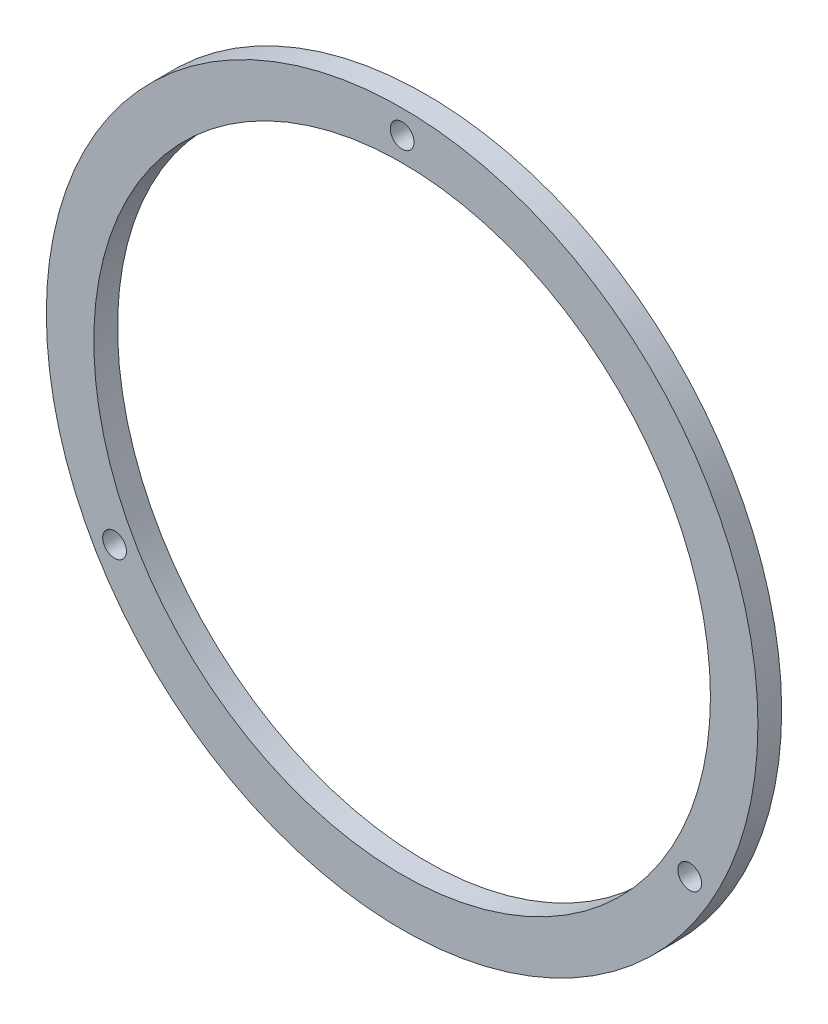
ISO-10303-21;
HEADER;
FILE_DESCRIPTION(('STEP AP214'),'2;1');
FILE_NAME('part.step','',(''),(''),'','','');
FILE_SCHEMA(('AUTOMOTIVE_DESIGN { 1 0 10303 214 1 1 1 1 }'));
ENDSEC;
DATA;
#1=APPLICATION_CONTEXT('core data for automotive mechanical design processes');
#2=APPLICATION_PROTOCOL_DEFINITION('international standard','automotive_design',2000,#1);
#3=PRODUCT_CONTEXT('',#1,'mechanical');
#4=PRODUCT('Part','Part','',(#3));
#5=PRODUCT_RELATED_PRODUCT_CATEGORY('part','',(#4));
#6=PRODUCT_DEFINITION_FORMATION('','',#4);
#7=PRODUCT_DEFINITION_CONTEXT('part definition',#1,'design');
#8=PRODUCT_DEFINITION('design','',#6,#7);
#9=PRODUCT_DEFINITION_SHAPE('','',#8);
#10=(LENGTH_UNIT() NAMED_UNIT(*) SI_UNIT(.MILLI.,.METRE.));
#11=(NAMED_UNIT(*) PLANE_ANGLE_UNIT() SI_UNIT($,.RADIAN.));
#12=(NAMED_UNIT(*) SI_UNIT($,.STERADIAN.) SOLID_ANGLE_UNIT());
#13=UNCERTAINTY_MEASURE_WITH_UNIT(LENGTH_MEASURE(1.E-05),#10,'distance_accuracy_value','');
#14=(GEOMETRIC_REPRESENTATION_CONTEXT(3) GLOBAL_UNCERTAINTY_ASSIGNED_CONTEXT((#13)) GLOBAL_UNIT_ASSIGNED_CONTEXT((#10,
#11,#12)) REPRESENTATION_CONTEXT('',''));
#15=CARTESIAN_POINT('',(0.,0.,0.));
#16=DIRECTION('',(0.,0.,1.));
#17=DIRECTION('',(1.,0.,0.));
#18=AXIS2_PLACEMENT_3D('',#15,#16,#17);
#19=CARTESIAN_POINT('',(0.,0.,6.35));
#20=DIRECTION('',(0.,0.,1.));
#21=DIRECTION('',(1.,0.,0.));
#22=AXIS2_PLACEMENT_3D('',#19,#20,#21);
#23=PLANE('',#22);
#24=CARTESIAN_POINT('',(0.,88.773,6.35));
#25=DIRECTION('',(0.,0.,1.));
#26=DIRECTION('',(1.,0.,0.));
#27=AXIS2_PLACEMENT_3D('',#24,#25,#26);
#28=CIRCLE('',#27,3.175);
#29=CARTESIAN_POINT('',(3.175,88.773,6.35));
#30=VERTEX_POINT('',#29);
#31=EDGE_CURVE('E64',#30,#30,#28,.T.);
#32=ORIENTED_EDGE('',*,*,#31,.F.);
#33=EDGE_LOOP('',(#32));
#34=FACE_BOUND('',#33,.T.);
#35=CARTESIAN_POINT('',(76.8796731701617,-44.3864999999967,6.35));
#36=DIRECTION('',(0.,0.,1.));
#37=DIRECTION('',(1.,0.,0.));
#38=AXIS2_PLACEMENT_3D('',#35,#36,#37);
#39=CIRCLE('',#38,3.17500000000487);
#40=CARTESIAN_POINT('',(80.0546731701665,-44.3864999999967,6.35));
#41=VERTEX_POINT('',#40);
#42=EDGE_CURVE('E58',#41,#41,#39,.T.);
#43=ORIENTED_EDGE('',*,*,#42,.F.);
#44=EDGE_LOOP('',(#43));
#45=FACE_BOUND('',#44,.T.);
#46=CARTESIAN_POINT('',(-76.8796731701503,-44.3865000000033,6.35));
#47=DIRECTION('',(0.,0.,1.));
#48=DIRECTION('',(1.,0.,0.));
#49=AXIS2_PLACEMENT_3D('',#46,#47,#48);
#50=CIRCLE('',#49,3.17500000000717);
#51=CARTESIAN_POINT('',(-73.7046731701432,-44.3865000000033,6.35));
#52=VERTEX_POINT('',#51);
#53=EDGE_CURVE('E52',#52,#52,#50,.T.);
#54=ORIENTED_EDGE('',*,*,#53,.F.);
#55=EDGE_LOOP('',(#54));
#56=FACE_BOUND('',#55,.T.);
#57=CARTESIAN_POINT('',(0.,0.,6.35));
#58=DIRECTION('',(0.,0.,1.));
#59=DIRECTION('',(1.,0.,0.));
#60=AXIS2_PLACEMENT_3D('',#57,#58,#59);
#61=CIRCLE('',#60,95.123);
#62=CARTESIAN_POINT('',(95.123,0.,6.35));
#63=VERTEX_POINT('',#62);
#64=EDGE_CURVE('E10',#63,#63,#61,.T.);
#65=ORIENTED_EDGE('',*,*,#64,.T.);
#66=EDGE_LOOP('',(#65));
#67=FACE_BOUND('',#66,.T.);
#68=CARTESIAN_POINT('',(0.,0.,6.35));
#69=DIRECTION('',(0.,0.,1.));
#70=DIRECTION('',(1.,0.,0.));
#71=AXIS2_PLACEMENT_3D('',#68,#69,#70);
#72=CIRCLE('',#71,82.42808);
#73=CARTESIAN_POINT('',(82.42808,0.,6.35));
#74=VERTEX_POINT('',#73);
#75=EDGE_CURVE('E44',#74,#74,#72,.T.);
#76=ORIENTED_EDGE('',*,*,#75,.F.);
#77=EDGE_LOOP('',(#76));
#78=FACE_BOUND('',#77,.T.);
#79=ADVANCED_FACE('F33',(#34,#45,#56,#67,#78),#23,.T.);
#80=CARTESIAN_POINT('',(0.,0.,0.));
#81=DIRECTION('',(0.,0.,1.));
#82=DIRECTION('',(1.,0.,0.));
#83=AXIS2_PLACEMENT_3D('',#80,#81,#82);
#84=PLANE('',#83);
#85=CARTESIAN_POINT('',(0.,88.773,0.));
#86=DIRECTION('',(0.,0.,1.));
#87=DIRECTION('',(1.,0.,0.));
#88=AXIS2_PLACEMENT_3D('',#85,#86,#87);
#89=CIRCLE('',#88,3.175);
#90=CARTESIAN_POINT('',(3.175,88.773,0.));
#91=VERTEX_POINT('',#90);
#92=EDGE_CURVE('E49',#91,#91,#89,.T.);
#93=ORIENTED_EDGE('',*,*,#92,.T.);
#94=EDGE_LOOP('',(#93));
#95=FACE_BOUND('',#94,.T.);
#96=CARTESIAN_POINT('',(76.8796731701617,-44.3864999999967,0.));
#97=DIRECTION('',(0.,0.,1.));
#98=DIRECTION('',(1.,0.,0.));
#99=AXIS2_PLACEMENT_3D('',#96,#97,#98);
#100=CIRCLE('',#99,3.17500000000487);
#101=CARTESIAN_POINT('',(80.0546731701665,-44.3864999999967,0.));
#102=VERTEX_POINT('',#101);
#103=EDGE_CURVE('E61',#102,#102,#100,.T.);
#104=ORIENTED_EDGE('',*,*,#103,.T.);
#105=EDGE_LOOP('',(#104));
#106=FACE_BOUND('',#105,.T.);
#107=CARTESIAN_POINT('',(-76.8796731701503,-44.3865000000033,0.));
#108=DIRECTION('',(0.,0.,1.));
#109=DIRECTION('',(1.,0.,0.));
#110=AXIS2_PLACEMENT_3D('',#107,#108,#109);
#111=CIRCLE('',#110,3.17500000000717);
#112=CARTESIAN_POINT('',(-73.7046731701432,-44.3865000000033,0.));
#113=VERTEX_POINT('',#112);
#114=EDGE_CURVE('E55',#113,#113,#111,.T.);
#115=ORIENTED_EDGE('',*,*,#114,.T.);
#116=EDGE_LOOP('',(#115));
#117=FACE_BOUND('',#116,.T.);
#118=CARTESIAN_POINT('',(0.,0.,0.));
#119=DIRECTION('',(0.,0.,1.));
#120=DIRECTION('',(1.,0.,0.));
#121=AXIS2_PLACEMENT_3D('',#118,#119,#120);
#122=CIRCLE('',#121,95.123);
#123=CARTESIAN_POINT('',(95.123,0.,0.));
#124=VERTEX_POINT('',#123);
#125=EDGE_CURVE('E37',#124,#124,#122,.T.);
#126=ORIENTED_EDGE('',*,*,#125,.F.);
#127=EDGE_LOOP('',(#126));
#128=FACE_BOUND('',#127,.T.);
#129=CARTESIAN_POINT('',(0.,0.,0.));
#130=DIRECTION('',(0.,0.,1.));
#131=DIRECTION('',(1.,0.,0.));
#132=AXIS2_PLACEMENT_3D('',#129,#130,#131);
#133=CIRCLE('',#132,82.42808);
#134=CARTESIAN_POINT('',(82.42808,0.,0.));
#135=VERTEX_POINT('',#134);
#136=EDGE_CURVE('E46',#135,#135,#133,.T.);
#137=ORIENTED_EDGE('',*,*,#136,.T.);
#138=EDGE_LOOP('',(#137));
#139=FACE_BOUND('',#138,.T.);
#140=ADVANCED_FACE('F70',(#95,#106,#117,#128,#139),#84,.F.);
#141=CARTESIAN_POINT('',(0.,0.,6.35));
#142=DIRECTION('',(0.,0.,-1.));
#143=DIRECTION('',(-1.,0.,0.));
#144=AXIS2_PLACEMENT_3D('',#141,#142,#143);
#145=CYLINDRICAL_SURFACE('',#144,95.123);
#146=ORIENTED_EDGE('',*,*,#64,.F.);
#147=EDGE_LOOP('',(#146));
#148=FACE_BOUND('',#147,.T.);
#149=ORIENTED_EDGE('',*,*,#125,.T.);
#150=EDGE_LOOP('',(#149));
#151=FACE_BOUND('',#150,.T.);
#152=ADVANCED_FACE('F35',(#148,#151),#145,.T.);
#153=CARTESIAN_POINT('',(0.,0.,6.35));
#154=DIRECTION('',(0.,0.,-1.));
#155=DIRECTION('',(-1.,0.,0.));
#156=AXIS2_PLACEMENT_3D('',#153,#154,#155);
#157=CYLINDRICAL_SURFACE('',#156,82.42808);
#158=ORIENTED_EDGE('',*,*,#75,.T.);
#159=EDGE_LOOP('',(#158));
#160=FACE_BOUND('',#159,.T.);
#161=ORIENTED_EDGE('',*,*,#136,.F.);
#162=EDGE_LOOP('',(#161));
#163=FACE_BOUND('',#162,.T.);
#164=ADVANCED_FACE('F89',(#160,#163),#157,.F.);
#165=CARTESIAN_POINT('',(-76.8796731701503,-44.3865000000033,0.));
#166=DIRECTION('',(0.,0.,1.));
#167=DIRECTION('',(1.,0.,0.));
#168=AXIS2_PLACEMENT_3D('',#165,#166,#167);
#169=CYLINDRICAL_SURFACE('',#168,3.17500000000717);
#170=ORIENTED_EDGE('',*,*,#114,.F.);
#171=EDGE_LOOP('',(#170));
#172=FACE_BOUND('',#171,.T.);
#173=ORIENTED_EDGE('',*,*,#53,.T.);
#174=EDGE_LOOP('',(#173));
#175=FACE_BOUND('',#174,.T.);
#176=ADVANCED_FACE('F92',(#172,#175),#169,.F.);
#177=CARTESIAN_POINT('',(76.8796731701617,-44.3864999999967,0.));
#178=DIRECTION('',(0.,0.,1.));
#179=DIRECTION('',(1.,0.,0.));
#180=AXIS2_PLACEMENT_3D('',#177,#178,#179);
#181=CYLINDRICAL_SURFACE('',#180,3.17500000000487);
#182=ORIENTED_EDGE('',*,*,#103,.F.);
#183=EDGE_LOOP('',(#182));
#184=FACE_BOUND('',#183,.T.);
#185=ORIENTED_EDGE('',*,*,#42,.T.);
#186=EDGE_LOOP('',(#185));
#187=FACE_BOUND('',#186,.T.);
#188=ADVANCED_FACE('F76',(#184,#187),#181,.F.);
#189=CARTESIAN_POINT('',(0.,88.773,0.));
#190=DIRECTION('',(0.,0.,1.));
#191=DIRECTION('',(1.,0.,0.));
#192=AXIS2_PLACEMENT_3D('',#189,#190,#191);
#193=CYLINDRICAL_SURFACE('',#192,3.175);
#194=ORIENTED_EDGE('',*,*,#92,.F.);
#195=EDGE_LOOP('',(#194));
#196=FACE_BOUND('',#195,.T.);
#197=ORIENTED_EDGE('',*,*,#31,.T.);
#198=EDGE_LOOP('',(#197));
#199=FACE_BOUND('',#198,.T.);
#200=ADVANCED_FACE('F73',(#196,#199),#193,.F.);
#201=CLOSED_SHELL('',(#79,#140,#152,#164,#176,#188,#200));
#202=MANIFOLD_SOLID_BREP('B2',#201);
#203=ADVANCED_BREP_SHAPE_REPRESENTATION('',(#18,#202),#14);
#204=SHAPE_DEFINITION_REPRESENTATION(#9,#203);
ENDSEC;
END-ISO-10303-21;
